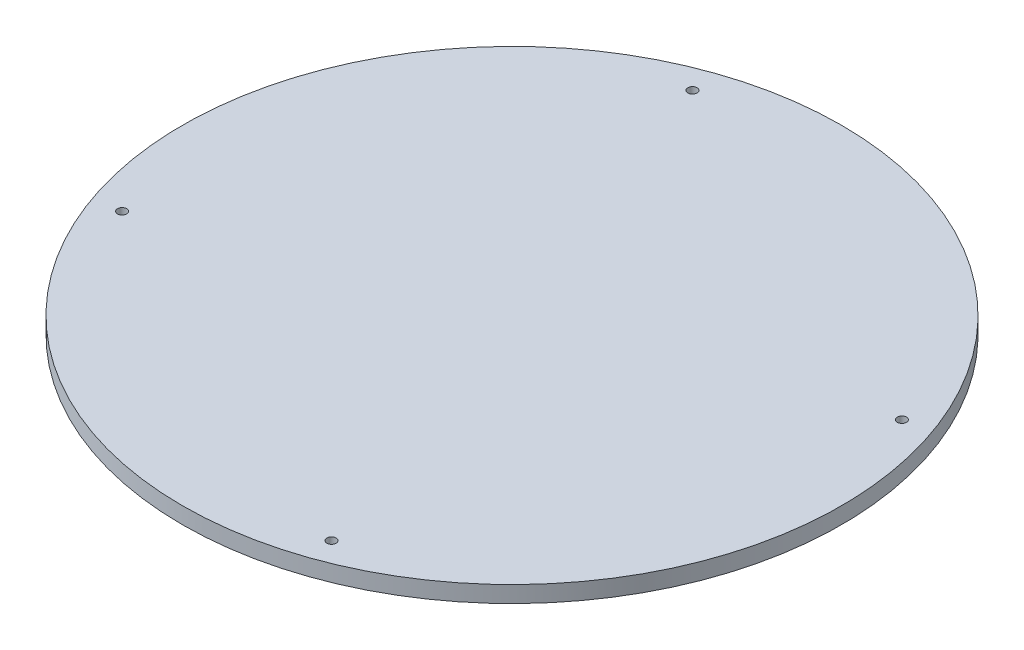
ISO-10303-21;
HEADER;
FILE_DESCRIPTION(('STEP AP214'),'2;1');
FILE_NAME('part.step','',(''),(''),'','','');
FILE_SCHEMA(('AUTOMOTIVE_DESIGN { 1 0 10303 214 1 1 1 1 }'));
ENDSEC;
DATA;
#1=APPLICATION_CONTEXT('core data for automotive mechanical design processes');
#2=APPLICATION_PROTOCOL_DEFINITION('international standard','automotive_design',2000,#1);
#3=PRODUCT_CONTEXT('',#1,'mechanical');
#4=PRODUCT('Part','Part','',(#3));
#5=PRODUCT_RELATED_PRODUCT_CATEGORY('part','',(#4));
#6=PRODUCT_DEFINITION_FORMATION('','',#4);
#7=PRODUCT_DEFINITION_CONTEXT('part definition',#1,'design');
#8=PRODUCT_DEFINITION('design','',#6,#7);
#9=PRODUCT_DEFINITION_SHAPE('','',#8);
#10=(LENGTH_UNIT() NAMED_UNIT(*) SI_UNIT(.MILLI.,.METRE.));
#11=(NAMED_UNIT(*) PLANE_ANGLE_UNIT() SI_UNIT($,.RADIAN.));
#12=(NAMED_UNIT(*) SI_UNIT($,.STERADIAN.) SOLID_ANGLE_UNIT());
#13=UNCERTAINTY_MEASURE_WITH_UNIT(LENGTH_MEASURE(1.E-05),#10,'distance_accuracy_value','');
#14=(GEOMETRIC_REPRESENTATION_CONTEXT(3) GLOBAL_UNCERTAINTY_ASSIGNED_CONTEXT((#13)) GLOBAL_UNIT_ASSIGNED_CONTEXT((#10,
#11,#12)) REPRESENTATION_CONTEXT('',''));
#15=CARTESIAN_POINT('',(0.,0.,0.));
#16=DIRECTION('',(0.,0.,1.));
#17=DIRECTION('',(1.,0.,0.));
#18=AXIS2_PLACEMENT_3D('',#15,#16,#17);
#19=CARTESIAN_POINT('',(0.,2.5,0.));
#20=DIRECTION('',(0.,-1.,0.));
#21=DIRECTION('',(0.,0.,-1.));
#22=AXIS2_PLACEMENT_3D('',#19,#20,#21);
#23=CYLINDRICAL_SURFACE('',#22,50.);
#24=CARTESIAN_POINT('',(0.,2.5,0.));
#25=DIRECTION('',(0.,1.,0.));
#26=DIRECTION('',(0.,0.,1.));
#27=AXIS2_PLACEMENT_3D('',#24,#25,#26);
#28=CIRCLE('',#27,50.);
#29=CARTESIAN_POINT('',(0.,2.5,50.));
#30=VERTEX_POINT('',#29);
#31=EDGE_CURVE('E10',#30,#30,#28,.T.);
#32=ORIENTED_EDGE('',*,*,#31,.F.);
#33=EDGE_LOOP('',(#32));
#34=FACE_BOUND('',#33,.T.);
#35=CARTESIAN_POINT('',(0.,0.,0.));
#36=DIRECTION('',(0.,1.,0.));
#37=DIRECTION('',(0.,0.,1.));
#38=AXIS2_PLACEMENT_3D('',#35,#36,#37);
#39=CIRCLE('',#38,50.);
#40=CARTESIAN_POINT('',(0.,0.,50.));
#41=VERTEX_POINT('',#40);
#42=EDGE_CURVE('E39',#41,#41,#39,.T.);
#43=ORIENTED_EDGE('',*,*,#42,.T.);
#44=EDGE_LOOP('',(#43));
#45=FACE_BOUND('',#44,.T.);
#46=ADVANCED_FACE('F32',(#34,#45),#23,.T.);
#47=CARTESIAN_POINT('',(0.,2.5,0.));
#48=DIRECTION('',(0.,1.,0.));
#49=DIRECTION('',(0.,0.,1.));
#50=AXIS2_PLACEMENT_3D('',#47,#48,#49);
#51=PLANE('',#50);
#52=CARTESIAN_POINT('',(-15.8910035327527,2.5,-43.2705033110417));
#53=DIRECTION('',(0.,1.,0.));
#54=DIRECTION('',(0.,0.,1.));
#55=AXIS2_PLACEMENT_3D('',#52,#53,#54);
#56=CIRCLE('',#55,0.698499999999999);
#57=CARTESIAN_POINT('',(-15.8910035327527,2.5,-42.5720033110417));
#58=VERTEX_POINT('',#57);
#59=EDGE_CURVE('E35',#58,#58,#56,.T.);
#60=ORIENTED_EDGE('',*,*,#59,.F.);
#61=EDGE_LOOP('',(#60));
#62=FACE_BOUND('',#61,.T.);
#63=CARTESIAN_POINT('',(-43.2705033110417,2.5,15.8910035327528));
#64=DIRECTION('',(0.,1.,0.));
#65=DIRECTION('',(0.,0.,1.));
#66=AXIS2_PLACEMENT_3D('',#63,#64,#65);
#67=CIRCLE('',#66,0.698499999999998);
#68=CARTESIAN_POINT('',(-43.2705033110417,2.5,16.5895035327528));
#69=VERTEX_POINT('',#68);
#70=EDGE_CURVE('E56',#69,#69,#67,.T.);
#71=ORIENTED_EDGE('',*,*,#70,.F.);
#72=EDGE_LOOP('',(#71));
#73=FACE_BOUND('',#72,.T.);
#74=CARTESIAN_POINT('',(15.891003532753,2.5,43.2705033110416));
#75=DIRECTION('',(0.,1.,0.));
#76=DIRECTION('',(0.,0.,1.));
#77=AXIS2_PLACEMENT_3D('',#74,#75,#76);
#78=CIRCLE('',#77,0.698499999999998);
#79=CARTESIAN_POINT('',(15.891003532753,2.5,43.9690033110416));
#80=VERTEX_POINT('',#79);
#81=EDGE_CURVE('E52',#80,#80,#78,.T.);
#82=ORIENTED_EDGE('',*,*,#81,.F.);
#83=EDGE_LOOP('',(#82));
#84=FACE_BOUND('',#83,.T.);
#85=CARTESIAN_POINT('',(43.2705033110415,2.5,-15.8910035327531));
#86=DIRECTION('',(0.,1.,0.));
#87=DIRECTION('',(0.,0.,1.));
#88=AXIS2_PLACEMENT_3D('',#85,#86,#87);
#89=CIRCLE('',#88,0.698499999999998);
#90=CARTESIAN_POINT('',(43.2705033110415,2.5,-15.1925035327531));
#91=VERTEX_POINT('',#90);
#92=EDGE_CURVE('E44',#91,#91,#89,.T.);
#93=ORIENTED_EDGE('',*,*,#92,.F.);
#94=EDGE_LOOP('',(#93));
#95=FACE_BOUND('',#94,.T.);
#96=ORIENTED_EDGE('',*,*,#31,.T.);
#97=EDGE_LOOP('',(#96));
#98=FACE_BOUND('',#97,.T.);
#99=ADVANCED_FACE('F104',(#62,#73,#84,#95,#98),#51,.T.);
#100=CARTESIAN_POINT('',(0.,0.,0.));
#101=DIRECTION('',(0.,1.,0.));
#102=DIRECTION('',(0.,0.,1.));
#103=AXIS2_PLACEMENT_3D('',#100,#101,#102);
#104=PLANE('',#103);
#105=CARTESIAN_POINT('',(-15.8910035327527,0.,-43.2705033110417));
#106=DIRECTION('',(0.,-1.,0.));
#107=DIRECTION('',(0.,0.,-1.));
#108=AXIS2_PLACEMENT_3D('',#105,#106,#107);
#109=CIRCLE('',#108,1.5875);
#110=CARTESIAN_POINT('',(-15.8910035327527,0.,-44.8580033110417));
#111=VERTEX_POINT('',#110);
#112=EDGE_CURVE('E121',#111,#111,#109,.T.);
#113=ORIENTED_EDGE('',*,*,#112,.F.);
#114=EDGE_LOOP('',(#113));
#115=FACE_BOUND('',#114,.T.);
#116=CARTESIAN_POINT('',(-43.2705033110417,0.,15.8910035327528));
#117=DIRECTION('',(0.,-1.,0.));
#118=DIRECTION('',(0.,0.,-1.));
#119=AXIS2_PLACEMENT_3D('',#116,#117,#118);
#120=CIRCLE('',#119,1.58749999999999);
#121=CARTESIAN_POINT('',(-43.2705033110417,0.,14.3035035327528));
#122=VERTEX_POINT('',#121);
#123=EDGE_CURVE('E71',#122,#122,#120,.T.);
#124=ORIENTED_EDGE('',*,*,#123,.F.);
#125=EDGE_LOOP('',(#124));
#126=FACE_BOUND('',#125,.T.);
#127=CARTESIAN_POINT('',(15.891003532753,0.,43.2705033110416));
#128=DIRECTION('',(0.,-1.,0.));
#129=DIRECTION('',(0.,0.,-1.));
#130=AXIS2_PLACEMENT_3D('',#127,#128,#129);
#131=CIRCLE('',#130,1.5875);
#132=CARTESIAN_POINT('',(15.891003532753,0.,41.6830033110416));
#133=VERTEX_POINT('',#132);
#134=EDGE_CURVE('E58',#133,#133,#131,.T.);
#135=ORIENTED_EDGE('',*,*,#134,.F.);
#136=EDGE_LOOP('',(#135));
#137=FACE_BOUND('',#136,.T.);
#138=CARTESIAN_POINT('',(43.2705033110415,0.,-15.8910035327531));
#139=DIRECTION('',(0.,-1.,0.));
#140=DIRECTION('',(0.,0.,-1.));
#141=AXIS2_PLACEMENT_3D('',#138,#139,#140);
#142=CIRCLE('',#141,1.58749999999999);
#143=CARTESIAN_POINT('',(43.2705033110415,0.,-17.4785035327531));
#144=VERTEX_POINT('',#143);
#145=EDGE_CURVE('E54',#144,#144,#142,.T.);
#146=ORIENTED_EDGE('',*,*,#145,.F.);
#147=EDGE_LOOP('',(#146));
#148=FACE_BOUND('',#147,.T.);
#149=ORIENTED_EDGE('',*,*,#42,.F.);
#150=EDGE_LOOP('',(#149));
#151=FACE_BOUND('',#150,.T.);
#152=ADVANCED_FACE('F100',(#115,#126,#137,#148,#151),#104,.F.);
#153=CARTESIAN_POINT('',(43.2705033110415,0.,-15.8910035327531));
#154=DIRECTION('',(0.,-1.,0.));
#155=DIRECTION('',(0.,0.,-1.));
#156=AXIS2_PLACEMENT_3D('',#153,#154,#155);
#157=CYLINDRICAL_SURFACE('',#156,0.698499999999998);
#158=ORIENTED_EDGE('',*,*,#92,.T.);
#159=EDGE_LOOP('',(#158));
#160=FACE_BOUND('',#159,.T.);
#161=CARTESIAN_POINT('',(43.2705033110415,0.711199999999999,-15.8910035327531));
#162=DIRECTION('',(0.,-1.,0.));
#163=DIRECTION('',(0.,0.,-1.));
#164=AXIS2_PLACEMENT_3D('',#161,#162,#163);
#165=CIRCLE('',#164,0.698499999999998);
#166=CARTESIAN_POINT('',(43.2705033110415,0.711199999999999,-16.5895035327531));
#167=VERTEX_POINT('',#166);
#168=EDGE_CURVE('E47',#167,#167,#165,.T.);
#169=ORIENTED_EDGE('',*,*,#168,.T.);
#170=EDGE_LOOP('',(#169));
#171=FACE_BOUND('',#170,.T.);
#172=ADVANCED_FACE('F87',(#160,#171),#157,.F.);
#173=CARTESIAN_POINT('',(43.9690033110415,0.711199999999999,-15.8910035327531));
#174=DIRECTION('',(0.,1.,0.));
#175=DIRECTION('',(0.,0.,1.));
#176=AXIS2_PLACEMENT_3D('',#173,#174,#175);
#177=PLANE('',#176);
#178=ORIENTED_EDGE('',*,*,#168,.F.);
#179=EDGE_LOOP('',(#178));
#180=FACE_BOUND('',#179,.T.);
#181=CARTESIAN_POINT('',(43.2705033110415,0.711199999999999,-15.8910035327531));
#182=DIRECTION('',(0.,-1.,0.));
#183=DIRECTION('',(0.,0.,-1.));
#184=AXIS2_PLACEMENT_3D('',#181,#182,#183);
#185=CIRCLE('',#184,1.5875);
#186=CARTESIAN_POINT('',(43.2705033110415,0.711199999999999,-17.4785035327531));
#187=VERTEX_POINT('',#186);
#188=EDGE_CURVE('E80',#187,#187,#185,.T.);
#189=ORIENTED_EDGE('',*,*,#188,.T.);
#190=EDGE_LOOP('',(#189));
#191=FACE_BOUND('',#190,.T.);
#192=ADVANCED_FACE('F89',(#180,#191),#177,.F.);
#193=CARTESIAN_POINT('',(43.2705033110415,0.,-15.8910035327531));
#194=DIRECTION('',(0.,-1.,0.));
#195=DIRECTION('',(0.,0.,-1.));
#196=AXIS2_PLACEMENT_3D('',#193,#194,#195);
#197=CYLINDRICAL_SURFACE('',#196,1.5875);
#198=ORIENTED_EDGE('',*,*,#188,.F.);
#199=EDGE_LOOP('',(#198));
#200=FACE_BOUND('',#199,.T.);
#201=ORIENTED_EDGE('',*,*,#145,.T.);
#202=EDGE_LOOP('',(#201));
#203=FACE_BOUND('',#202,.T.);
#204=ADVANCED_FACE('F91',(#200,#203),#197,.F.);
#205=CARTESIAN_POINT('',(15.891003532753,0.,43.2705033110416));
#206=DIRECTION('',(0.,-1.,0.));
#207=DIRECTION('',(0.,0.,-1.));
#208=AXIS2_PLACEMENT_3D('',#205,#206,#207);
#209=CYLINDRICAL_SURFACE('',#208,0.698499999999998);
#210=ORIENTED_EDGE('',*,*,#81,.T.);
#211=EDGE_LOOP('',(#210));
#212=FACE_BOUND('',#211,.T.);
#213=CARTESIAN_POINT('',(15.891003532753,0.711199999999999,43.2705033110416));
#214=DIRECTION('',(0.,-1.,0.));
#215=DIRECTION('',(0.,0.,-1.));
#216=AXIS2_PLACEMENT_3D('',#213,#214,#215);
#217=CIRCLE('',#216,0.698499999999998);
#218=CARTESIAN_POINT('',(15.891003532753,0.711199999999999,42.5720033110416));
#219=VERTEX_POINT('',#218);
#220=EDGE_CURVE('E55',#219,#219,#217,.T.);
#221=ORIENTED_EDGE('',*,*,#220,.T.);
#222=EDGE_LOOP('',(#221));
#223=FACE_BOUND('',#222,.T.);
#224=ADVANCED_FACE('F97',(#212,#223),#209,.F.);
#225=CARTESIAN_POINT('',(16.589503532753,0.711199999999999,43.2705033110416));
#226=DIRECTION('',(0.,1.,0.));
#227=DIRECTION('',(0.,0.,1.));
#228=AXIS2_PLACEMENT_3D('',#225,#226,#227);
#229=PLANE('',#228);
#230=ORIENTED_EDGE('',*,*,#220,.F.);
#231=EDGE_LOOP('',(#230));
#232=FACE_BOUND('',#231,.T.);
#233=CARTESIAN_POINT('',(15.891003532753,0.711199999999999,43.2705033110416));
#234=DIRECTION('',(0.,-1.,0.));
#235=DIRECTION('',(0.,0.,-1.));
#236=AXIS2_PLACEMENT_3D('',#233,#234,#235);
#237=CIRCLE('',#236,1.5875);
#238=CARTESIAN_POINT('',(15.891003532753,0.711199999999999,41.6830033110416));
#239=VERTEX_POINT('',#238);
#240=EDGE_CURVE('E63',#239,#239,#237,.T.);
#241=ORIENTED_EDGE('',*,*,#240,.T.);
#242=EDGE_LOOP('',(#241));
#243=FACE_BOUND('',#242,.T.);
#244=ADVANCED_FACE('F133',(#232,#243),#229,.F.);
#245=CARTESIAN_POINT('',(15.891003532753,0.,43.2705033110416));
#246=DIRECTION('',(0.,-1.,0.));
#247=DIRECTION('',(0.,0.,-1.));
#248=AXIS2_PLACEMENT_3D('',#245,#246,#247);
#249=CYLINDRICAL_SURFACE('',#248,1.5875);
#250=ORIENTED_EDGE('',*,*,#240,.F.);
#251=EDGE_LOOP('',(#250));
#252=FACE_BOUND('',#251,.T.);
#253=ORIENTED_EDGE('',*,*,#134,.T.);
#254=EDGE_LOOP('',(#253));
#255=FACE_BOUND('',#254,.T.);
#256=ADVANCED_FACE('F130',(#252,#255),#249,.F.);
#257=CARTESIAN_POINT('',(-43.2705033110417,0.,15.8910035327528));
#258=DIRECTION('',(0.,-1.,0.));
#259=DIRECTION('',(0.,0.,-1.));
#260=AXIS2_PLACEMENT_3D('',#257,#258,#259);
#261=CYLINDRICAL_SURFACE('',#260,0.698499999999998);
#262=ORIENTED_EDGE('',*,*,#70,.T.);
#263=EDGE_LOOP('',(#262));
#264=FACE_BOUND('',#263,.T.);
#265=CARTESIAN_POINT('',(-43.2705033110417,0.711199999999999,15.8910035327528));
#266=DIRECTION('',(0.,-1.,0.));
#267=DIRECTION('',(0.,0.,-1.));
#268=AXIS2_PLACEMENT_3D('',#265,#266,#267);
#269=CIRCLE('',#268,0.698499999999998);
#270=CARTESIAN_POINT('',(-43.2705033110417,0.711199999999999,15.1925035327528));
#271=VERTEX_POINT('',#270);
#272=EDGE_CURVE('E59',#271,#271,#269,.T.);
#273=ORIENTED_EDGE('',*,*,#272,.T.);
#274=EDGE_LOOP('',(#273));
#275=FACE_BOUND('',#274,.T.);
#276=ADVANCED_FACE('F132',(#264,#275),#261,.F.);
#277=CARTESIAN_POINT('',(-42.5720033110417,0.711199999999999,15.8910035327528));
#278=DIRECTION('',(0.,1.,0.));
#279=DIRECTION('',(0.,0.,1.));
#280=AXIS2_PLACEMENT_3D('',#277,#278,#279);
#281=PLANE('',#280);
#282=ORIENTED_EDGE('',*,*,#272,.F.);
#283=EDGE_LOOP('',(#282));
#284=FACE_BOUND('',#283,.T.);
#285=CARTESIAN_POINT('',(-43.2705033110417,0.711199999999999,15.8910035327528));
#286=DIRECTION('',(0.,-1.,0.));
#287=DIRECTION('',(0.,0.,-1.));
#288=AXIS2_PLACEMENT_3D('',#285,#286,#287);
#289=CIRCLE('',#288,1.5875);
#290=CARTESIAN_POINT('',(-43.2705033110417,0.711199999999999,14.3035035327528));
#291=VERTEX_POINT('',#290);
#292=EDGE_CURVE('E66',#291,#291,#289,.T.);
#293=ORIENTED_EDGE('',*,*,#292,.T.);
#294=EDGE_LOOP('',(#293));
#295=FACE_BOUND('',#294,.T.);
#296=ADVANCED_FACE('F140',(#284,#295),#281,.F.);
#297=CARTESIAN_POINT('',(-43.2705033110417,0.,15.8910035327528));
#298=DIRECTION('',(0.,-1.,0.));
#299=DIRECTION('',(0.,0.,-1.));
#300=AXIS2_PLACEMENT_3D('',#297,#298,#299);
#301=CYLINDRICAL_SURFACE('',#300,1.5875);
#302=ORIENTED_EDGE('',*,*,#292,.F.);
#303=EDGE_LOOP('',(#302));
#304=FACE_BOUND('',#303,.T.);
#305=ORIENTED_EDGE('',*,*,#123,.T.);
#306=EDGE_LOOP('',(#305));
#307=FACE_BOUND('',#306,.T.);
#308=ADVANCED_FACE('F183',(#304,#307),#301,.F.);
#309=CARTESIAN_POINT('',(-15.8910035327527,0.,-43.2705033110417));
#310=DIRECTION('',(0.,-1.,0.));
#311=DIRECTION('',(0.,0.,-1.));
#312=AXIS2_PLACEMENT_3D('',#309,#310,#311);
#313=CYLINDRICAL_SURFACE('',#312,0.698499999999999);
#314=ORIENTED_EDGE('',*,*,#59,.T.);
#315=EDGE_LOOP('',(#314));
#316=FACE_BOUND('',#315,.T.);
#317=CARTESIAN_POINT('',(-15.8910035327527,0.711199999999999,-43.2705033110417));
#318=DIRECTION('',(0.,-1.,0.));
#319=DIRECTION('',(0.,0.,-1.));
#320=AXIS2_PLACEMENT_3D('',#317,#318,#319);
#321=CIRCLE('',#320,0.698499999999999);
#322=CARTESIAN_POINT('',(-15.8910035327527,0.711199999999999,-43.9690033110417));
#323=VERTEX_POINT('',#322);
#324=EDGE_CURVE('E231',#323,#323,#321,.T.);
#325=ORIENTED_EDGE('',*,*,#324,.T.);
#326=EDGE_LOOP('',(#325));
#327=FACE_BOUND('',#326,.T.);
#328=ADVANCED_FACE('F192',(#316,#327),#313,.F.);
#329=CARTESIAN_POINT('',(-15.1925035327527,0.711199999999999,-43.2705033110417));
#330=DIRECTION('',(0.,1.,0.));
#331=DIRECTION('',(0.,0.,1.));
#332=AXIS2_PLACEMENT_3D('',#329,#330,#331);
#333=PLANE('',#332);
#334=ORIENTED_EDGE('',*,*,#324,.F.);
#335=EDGE_LOOP('',(#334));
#336=FACE_BOUND('',#335,.T.);
#337=CARTESIAN_POINT('',(-15.8910035327527,0.711199999999999,-43.2705033110417));
#338=DIRECTION('',(0.,-1.,0.));
#339=DIRECTION('',(0.,0.,-1.));
#340=AXIS2_PLACEMENT_3D('',#337,#338,#339);
#341=CIRCLE('',#340,1.5875);
#342=CARTESIAN_POINT('',(-15.8910035327527,0.711199999999999,-44.8580033110417));
#343=VERTEX_POINT('',#342);
#344=EDGE_CURVE('E229',#343,#343,#341,.T.);
#345=ORIENTED_EDGE('',*,*,#344,.T.);
#346=EDGE_LOOP('',(#345));
#347=FACE_BOUND('',#346,.T.);
#348=ADVANCED_FACE('F202',(#336,#347),#333,.F.);
#349=CARTESIAN_POINT('',(-15.8910035327527,0.,-43.2705033110417));
#350=DIRECTION('',(0.,-1.,0.));
#351=DIRECTION('',(0.,0.,-1.));
#352=AXIS2_PLACEMENT_3D('',#349,#350,#351);
#353=CYLINDRICAL_SURFACE('',#352,1.5875);
#354=ORIENTED_EDGE('',*,*,#344,.F.);
#355=EDGE_LOOP('',(#354));
#356=FACE_BOUND('',#355,.T.);
#357=ORIENTED_EDGE('',*,*,#112,.T.);
#358=EDGE_LOOP('',(#357));
#359=FACE_BOUND('',#358,.T.);
#360=ADVANCED_FACE('F212',(#356,#359),#353,.F.);
#361=CLOSED_SHELL('',(#46,#99,#152,#172,#192,#204,#224,#244,#256,#276,#296,#308,#328,#348,#360));
#362=MANIFOLD_SOLID_BREP('B2',#361);
#363=ADVANCED_BREP_SHAPE_REPRESENTATION('',(#18,#362),#14);
#364=SHAPE_DEFINITION_REPRESENTATION(#9,#363);
ENDSEC;
END-ISO-10303-21;
